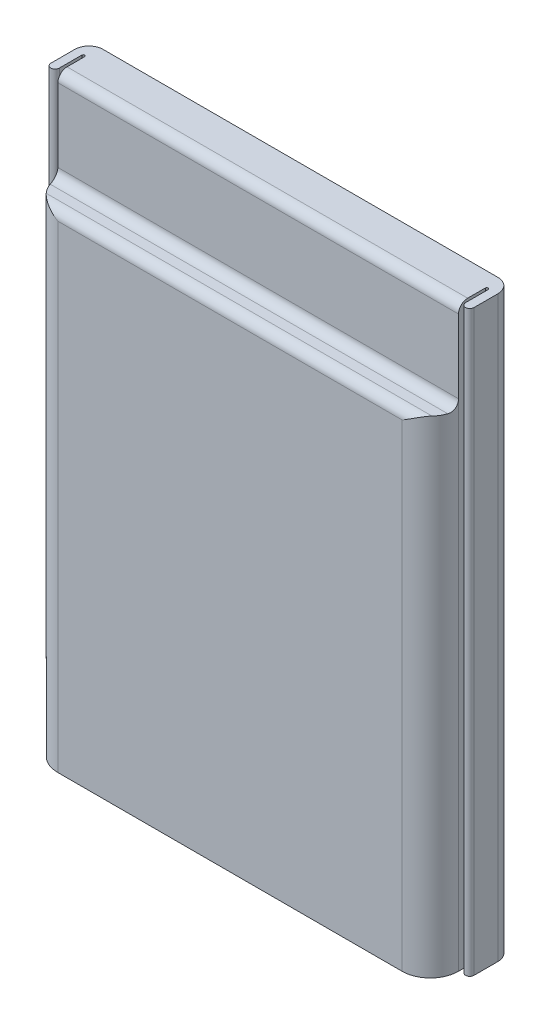
ISO-10303-21;
HEADER;
FILE_DESCRIPTION(('STEP AP214'),'2;1');
FILE_NAME('part.step','',(''),(''),'','','');
FILE_SCHEMA(('AUTOMOTIVE_DESIGN { 1 0 10303 214 1 1 1 1 }'));
ENDSEC;
DATA;
#1=APPLICATION_CONTEXT('core data for automotive mechanical design processes');
#2=APPLICATION_PROTOCOL_DEFINITION('international standard','automotive_design',2000,#1);
#3=PRODUCT_CONTEXT('',#1,'mechanical');
#4=PRODUCT('Part','Part','',(#3));
#5=PRODUCT_RELATED_PRODUCT_CATEGORY('part','',(#4));
#6=PRODUCT_DEFINITION_FORMATION('','',#4);
#7=PRODUCT_DEFINITION_CONTEXT('part definition',#1,'design');
#8=PRODUCT_DEFINITION('design','',#6,#7);
#9=PRODUCT_DEFINITION_SHAPE('','',#8);
#10=(LENGTH_UNIT() NAMED_UNIT(*) SI_UNIT(.MILLI.,.METRE.));
#11=(NAMED_UNIT(*) PLANE_ANGLE_UNIT() SI_UNIT($,.RADIAN.));
#12=(NAMED_UNIT(*) SI_UNIT($,.STERADIAN.) SOLID_ANGLE_UNIT());
#13=UNCERTAINTY_MEASURE_WITH_UNIT(LENGTH_MEASURE(1.E-05),#10,'distance_accuracy_value','');
#14=(GEOMETRIC_REPRESENTATION_CONTEXT(3) GLOBAL_UNCERTAINTY_ASSIGNED_CONTEXT((#13)) GLOBAL_UNIT_ASSIGNED_CONTEXT((#10,
#11,#12)) REPRESENTATION_CONTEXT('',''));
#15=CARTESIAN_POINT('',(0.,0.,0.));
#16=DIRECTION('',(0.,0.,1.));
#17=DIRECTION('',(1.,0.,0.));
#18=AXIS2_PLACEMENT_3D('',#15,#16,#17);
#19=CARTESIAN_POINT('',(-14.2,20.5,3.));
#20=DIRECTION('',(1.,0.,0.));
#21=DIRECTION('',(0.,0.,-1.));
#22=AXIS2_PLACEMENT_3D('',#19,#20,#21);
#23=PLANE('',#22);
#24=CARTESIAN_POINT('',(-14.2,19.85,2.35));
#25=DIRECTION('',(1.,0.,0.));
#26=DIRECTION('',(0.,0.,-1.));
#27=AXIS2_PLACEMENT_3D('',#24,#25,#26);
#28=CIRCLE('',#27,0.650000000000001);
#29=CARTESIAN_POINT('',(-14.2,20.5,2.35));
#30=VERTEX_POINT('',#29);
#31=CARTESIAN_POINT('',(-14.2,19.85,3.));
#32=VERTEX_POINT('',#31);
#33=EDGE_CURVE('E450',#30,#32,#28,.T.);
#34=ORIENTED_EDGE('',*,*,#33,.F.);
#35=DIRECTION('',(0.,0.,1.));
#36=VECTOR('',#35,1.);
#37=CARTESIAN_POINT('',(-14.2,20.5,3.));
#38=LINE('',#37,#36);
#39=CARTESIAN_POINT('',(-14.2,20.5,1.1));
#40=VERTEX_POINT('',#39);
#41=EDGE_CURVE('E266',#40,#30,#38,.T.);
#42=ORIENTED_EDGE('',*,*,#41,.F.);
#43=DIRECTION('',(0.,-1.,0.));
#44=VECTOR('',#43,1.);
#45=CARTESIAN_POINT('',(-14.2,20.5,1.1));
#46=LINE('',#45,#44);
#47=CARTESIAN_POINT('',(-14.2,-20.5,1.1));
#48=VERTEX_POINT('',#47);
#49=EDGE_CURVE('E234',#40,#48,#46,.T.);
#50=ORIENTED_EDGE('',*,*,#49,.T.);
#51=DIRECTION('',(0.,0.,1.));
#52=VECTOR('',#51,1.);
#53=CARTESIAN_POINT('',(-14.2,-20.5,3.));
#54=LINE('',#53,#52);
#55=CARTESIAN_POINT('',(-14.2,-20.5,3.));
#56=VERTEX_POINT('',#55);
#57=EDGE_CURVE('E189',#48,#56,#54,.T.);
#58=ORIENTED_EDGE('',*,*,#57,.T.);
#59=DIRECTION('',(0.,-1.,0.));
#60=VECTOR('',#59,1.);
#61=CARTESIAN_POINT('',(-14.2,20.5,3.));
#62=LINE('',#61,#60);
#63=CARTESIAN_POINT('',(-14.2,14.65,3.));
#64=VERTEX_POINT('',#63);
#65=EDGE_CURVE('E232',#64,#56,#62,.T.);
#66=ORIENTED_EDGE('',*,*,#65,.F.);
#67=DIRECTION('',(0.,-1.,0.));
#68=VECTOR('',#67,1.);
#69=CARTESIAN_POINT('',(-14.2,20.5,3.));
#70=LINE('',#69,#68);
#71=EDGE_CURVE('E433',#32,#64,#70,.T.);
#72=ORIENTED_EDGE('',*,*,#71,.F.);
#73=EDGE_LOOP('',(#34,#42,#50,#58,#66,#72));
#74=FACE_BOUND('',#73,.T.);
#75=ADVANCED_FACE('F33',(#74),#23,.F.);
#76=CARTESIAN_POINT('',(-12.2,20.5,3.));
#77=DIRECTION('',(0.,-1.,0.));
#78=DIRECTION('',(0.,0.,-1.));
#79=AXIS2_PLACEMENT_3D('',#76,#77,#78);
#80=CYLINDRICAL_SURFACE('',#79,2.);
#81=CARTESIAN_POINT('',(-14.2,14.65,3.));
#82=CARTESIAN_POINT('',(-14.1999715333076,14.6134705249712,2.99996898966149));
#83=CARTESIAN_POINT('',(-14.1999995182946,14.5769499170187,3.00307754988292));
#84=CARTESIAN_POINT('',(-14.1999580467136,14.5049609758304,3.01534640676728));
#85=CARTESIAN_POINT('',(-14.1998886483359,14.4694920271167,3.02450308771743));
#86=CARTESIAN_POINT('',(-14.1994424133602,14.4005763476328,3.04864777686902));
#87=CARTESIAN_POINT('',(-14.1990654113068,14.367130715576,3.06363892106971));
#88=CARTESIAN_POINT('',(-14.1976264276688,14.3032422256214,3.0990089930902));
#89=CARTESIAN_POINT('',(-14.1965645581985,14.2727988771835,3.11938703874022));
#90=CARTESIAN_POINT('',(-14.1933254727069,14.2159189707974,3.16482691344794));
#91=CARTESIAN_POINT('',(-14.19115317581,14.1894654021372,3.18986777807398));
#92=CARTESIAN_POINT('',(-14.185257441474,14.1411791612644,3.24390474724929));
#93=CARTESIAN_POINT('',(-14.18153437101,14.1193453976631,3.2728999149611));
#94=CARTESIAN_POINT('',(-14.172258117094,14.0812476728007,3.33333874013283));
#95=CARTESIAN_POINT('',(-14.1667389441375,14.0648908650406,3.36472917526913));
#96=CARTESIAN_POINT('',(-14.1536413514661,14.0375782654173,3.42938564281086));
#97=CARTESIAN_POINT('',(-14.1460626804103,14.0266231332334,3.46265190374891));
#98=CARTESIAN_POINT('',(-14.1309180671935,14.0122336114247,3.52177261300965));
#99=CARTESIAN_POINT('',(-14.1237967817437,14.007618429263,3.54746322722828));
#100=CARTESIAN_POINT('',(-14.1084361518207,14.0015002563595,3.59883111134542));
#101=CARTESIAN_POINT('',(-14.1001988565738,13.9999916416918,3.62450832107817));
#102=CARTESIAN_POINT('',(-14.0914280319378,14.,3.65));
#103=B_SPLINE_CURVE_WITH_KNOTS('',3,(#81,#82,#83,#84,#85,#86,#87,#88,#89,#90,#91,#92,#93,#94,
#95,#96,#97,#98,#99,#100,#101,#102),.UNSPECIFIED.,.F.,.F.,(4,2,2,2,2,2,2,2,2,2,4),(0.,
0.109443842133303,0.218822315238405,0.328259660182429,0.437679094538202,0.546617954929262,
0.655531050658533,0.762491353507339,0.86946471564608,0.950436647907691,1.03126186456902),.UNSPECIFIED.);
#104=CARTESIAN_POINT('',(-14.0914280319378,14.,3.65));
#105=VERTEX_POINT('',#104);
#106=EDGE_CURVE('E430',#64,#105,#103,.T.);
#107=ORIENTED_EDGE('',*,*,#106,.F.);
#108=ORIENTED_EDGE('',*,*,#65,.T.);
#109=CARTESIAN_POINT('',(-12.2,-20.5,3.));
#110=DIRECTION('',(0.,1.,0.));
#111=DIRECTION('',(0.,0.,1.));
#112=AXIS2_PLACEMENT_3D('',#109,#110,#111);
#113=CIRCLE('',#112,2.);
#114=CARTESIAN_POINT('',(-12.2,-20.5,5.));
#115=VERTEX_POINT('',#114);
#116=EDGE_CURVE('E192',#56,#115,#113,.T.);
#117=ORIENTED_EDGE('',*,*,#116,.T.);
#118=DIRECTION('',(0.,-1.,0.));
#119=VECTOR('',#118,1.);
#120=CARTESIAN_POINT('',(-12.2,20.5,5.));
#121=LINE('',#120,#119);
#122=CARTESIAN_POINT('',(-12.2,13.35,5.));
#123=VERTEX_POINT('',#122);
#124=EDGE_CURVE('E230',#123,#115,#121,.T.);
#125=ORIENTED_EDGE('',*,*,#124,.F.);
#126=CARTESIAN_POINT('',(-13.6756354563374,14.,4.35));
#127=CARTESIAN_POINT('',(-13.6526747888121,13.9999932469629,4.37510429602965));
#128=CARTESIAN_POINT('',(-13.629092967008,13.9985470125779,4.39958775562649));
#129=CARTESIAN_POINT('',(-13.5809067781463,13.9931451991544,4.44714747151512));
#130=CARTESIAN_POINT('',(-13.5563044500062,13.98919441785,4.47022632604328));
#131=CARTESIAN_POINT('',(-13.4816585836141,13.9742282759658,4.53680407014388));
#132=CARTESIAN_POINT('',(-13.4303126692842,13.9600840157248,4.57814755553334));
#133=CARTESIAN_POINT('',(-13.3008541290508,13.9177087843941,4.67247974823716));
#134=CARTESIAN_POINT('',(-13.2213753583094,13.8859868263596,4.72197198080512));
#135=CARTESIAN_POINT('',(-13.0589684463905,13.8141624891678,4.80851066967203));
#136=CARTESIAN_POINT('',(-12.9760211472614,13.774006663803,4.84547362186481));
#137=CARTESIAN_POINT('',(-12.7799445242252,13.6741623799292,4.91780631918262));
#138=CARTESIAN_POINT('',(-12.6660940623515,13.6124606757063,4.94841050017293));
#139=CARTESIAN_POINT('',(-12.4373647936439,13.4852882861592,4.98924690264115));
#140=CARTESIAN_POINT('',(-12.3224900789549,13.4198294206404,4.99953975746522));
#141=CARTESIAN_POINT('',(-12.2051801140564,13.3529531167111,4.99999495627204));
#142=CARTESIAN_POINT('',(-12.2025900127255,13.3514765316063,4.99999998679931));
#143=CARTESIAN_POINT('',(-12.2,13.35,5.));
#144=B_SPLINE_CURVE_WITH_KNOTS('',3,(#126,#127,#128,#129,#130,#131,#132,#133,#134,#135,#136,
#137,#138,#139,#140,#141,#142,#143),.UNSPECIFIED.,.F.,.F.,(4,2,2,2,2,2,2,2,4),(0.,
0.101961062793658,0.203727395778618,0.405233373896113,0.700228855017827,0.997153423353582,
1.39448612501562,1.79063090440368,1.79957518905046),.UNSPECIFIED.);
#145=CARTESIAN_POINT('',(-13.6756354563374,14.,4.35));
#146=VERTEX_POINT('',#145);
#147=EDGE_CURVE('E431',#146,#123,#144,.T.);
#148=ORIENTED_EDGE('',*,*,#147,.F.);
#149=CARTESIAN_POINT('',(-12.2,14.,3.));
#150=DIRECTION('',(0.,-1.,0.));
#151=DIRECTION('',(0.,0.,-1.));
#152=AXIS2_PLACEMENT_3D('',#149,#150,#151);
#153=CIRCLE('',#152,2.);
#154=EDGE_CURVE('E424',#105,#146,#153,.F.);
#155=ORIENTED_EDGE('',*,*,#154,.F.);
#156=EDGE_LOOP('',(#107,#108,#117,#125,#148,#155));
#157=FACE_BOUND('',#156,.T.);
#158=ADVANCED_FACE('F358',(#157),#80,.T.);
#159=CARTESIAN_POINT('',(12.2,20.5,3.));
#160=DIRECTION('',(0.,-1.,0.));
#161=DIRECTION('',(0.,0.,-1.));
#162=AXIS2_PLACEMENT_3D('',#159,#160,#161);
#163=CYLINDRICAL_SURFACE('',#162,2.);
#164=CARTESIAN_POINT('',(14.2,14.65,3.));
#165=CARTESIAN_POINT('',(14.1999715333076,14.6134705249712,2.99996898966149));
#166=CARTESIAN_POINT('',(14.1999995182946,14.5769499170187,3.00307754988292));
#167=CARTESIAN_POINT('',(14.1999580467136,14.5049609758304,3.01534640676728));
#168=CARTESIAN_POINT('',(14.1998886483359,14.4694920271167,3.02450308771743));
#169=CARTESIAN_POINT('',(14.1994424133602,14.4005763476328,3.04864777686902));
#170=CARTESIAN_POINT('',(14.1990654113068,14.367130715576,3.06363892106971));
#171=CARTESIAN_POINT('',(14.1976264276688,14.3032422256214,3.0990089930902));
#172=CARTESIAN_POINT('',(14.1965645581985,14.2727988771835,3.11938703874022));
#173=CARTESIAN_POINT('',(14.1933254727069,14.2159189707974,3.16482691344795));
#174=CARTESIAN_POINT('',(14.19115317581,14.1894654021372,3.18986777807399));
#175=CARTESIAN_POINT('',(14.185257441474,14.1411791612644,3.24390474724929));
#176=CARTESIAN_POINT('',(14.18153437101,14.1193453976631,3.2728999149611));
#177=CARTESIAN_POINT('',(14.172258117094,14.0812476728007,3.33333874013283));
#178=CARTESIAN_POINT('',(14.1667389441375,14.0648908650406,3.36472917526913));
#179=CARTESIAN_POINT('',(14.1536413514661,14.0375782654173,3.42938564281086));
#180=CARTESIAN_POINT('',(14.1460626804103,14.0266231332334,3.46265190374891));
#181=CARTESIAN_POINT('',(14.1309180671935,14.0122336114247,3.52177261300964));
#182=CARTESIAN_POINT('',(14.1237967817437,14.007618429263,3.54746322722828));
#183=CARTESIAN_POINT('',(14.1084361518207,14.0015002563595,3.59883111134542));
#184=CARTESIAN_POINT('',(14.1001988565738,13.9999916416918,3.62450832107817));
#185=CARTESIAN_POINT('',(14.0914280319378,14.,3.65));
#186=B_SPLINE_CURVE_WITH_KNOTS('',3,(#164,#165,#166,#167,#168,#169,#170,#171,#172,#173,#174,
#175,#176,#177,#178,#179,#180,#181,#182,#183,#184,#185),.UNSPECIFIED.,.F.,.F.,(4,2,2,2,2,2,2,2,
2,2,4),(0.,0.109443842133303,0.218822315238405,0.328259660182429,0.437679094538202,
0.546617954929263,0.655531050658534,0.76249135350734,0.86946471564608,0.950436647907691,
1.03126186456902),.UNSPECIFIED.);
#187=CARTESIAN_POINT('',(14.2,14.65,3.));
#188=VERTEX_POINT('',#187);
#189=CARTESIAN_POINT('',(14.0914280319378,14.,3.65));
#190=VERTEX_POINT('',#189);
#191=EDGE_CURVE('E337',#188,#190,#186,.T.);
#192=ORIENTED_EDGE('',*,*,#191,.T.);
#193=CARTESIAN_POINT('',(12.2,14.,3.));
#194=DIRECTION('',(0.,1.,0.));
#195=DIRECTION('',(0.,0.,1.));
#196=AXIS2_PLACEMENT_3D('',#193,#194,#195);
#197=CIRCLE('',#196,2.);
#198=CARTESIAN_POINT('',(13.6756354563374,14.,4.35));
#199=VERTEX_POINT('',#198);
#200=EDGE_CURVE('E323',#190,#199,#197,.F.);
#201=ORIENTED_EDGE('',*,*,#200,.T.);
#202=CARTESIAN_POINT('',(13.6756354563374,14.,4.35));
#203=CARTESIAN_POINT('',(13.6526747888121,13.9999932469629,4.37510429602965));
#204=CARTESIAN_POINT('',(13.629092967008,13.9985470125779,4.39958775562649));
#205=CARTESIAN_POINT('',(13.5809067781463,13.9931451991544,4.44714747151513));
#206=CARTESIAN_POINT('',(13.5563044500061,13.98919441785,4.47022632604329));
#207=CARTESIAN_POINT('',(13.4816585836141,13.9742282759658,4.53680407014389));
#208=CARTESIAN_POINT('',(13.4303126692842,13.9600840157248,4.57814755553334));
#209=CARTESIAN_POINT('',(13.3008541290508,13.9177087843941,4.67247974823716));
#210=CARTESIAN_POINT('',(13.2213753583094,13.8859868263596,4.72197198080512));
#211=CARTESIAN_POINT('',(13.0589684463905,13.8141624891678,4.80851066967203));
#212=CARTESIAN_POINT('',(12.9760211472614,13.774006663803,4.84547362186482));
#213=CARTESIAN_POINT('',(12.7799445242252,13.6741623799291,4.91780631918262));
#214=CARTESIAN_POINT('',(12.6660940623516,13.6124606757061,4.94841050017292));
#215=CARTESIAN_POINT('',(12.4373647936437,13.4852882861594,4.98924690264115));
#216=CARTESIAN_POINT('',(12.3224900789544,13.4198294206411,4.99953975746523));
#217=CARTESIAN_POINT('',(12.2051801140564,13.3529531167111,4.99999495627204));
#218=CARTESIAN_POINT('',(12.2025900127255,13.3514765316063,4.99999998679931));
#219=CARTESIAN_POINT('',(12.2,13.35,5.));
#220=B_SPLINE_CURVE_WITH_KNOTS('',3,(#202,#203,#204,#205,#206,#207,#208,#209,#210,#211,#212,
#213,#214,#215,#216,#217,#218,#219),.UNSPECIFIED.,.F.,.F.,(4,2,2,2,2,2,2,2,4),(0.,
0.101961062793669,0.203727395778643,0.405233373896116,0.700228855017819,0.997153423353591,
1.39448612501563,1.79063090440368,1.79957518905045),.UNSPECIFIED.);
#221=CARTESIAN_POINT('',(12.2,13.35,5.));
#222=VERTEX_POINT('',#221);
#223=EDGE_CURVE('E314',#199,#222,#220,.T.);
#224=ORIENTED_EDGE('',*,*,#223,.T.);
#225=DIRECTION('',(0.,-1.,0.));
#226=VECTOR('',#225,1.);
#227=CARTESIAN_POINT('',(12.2,20.5,5.));
#228=LINE('',#227,#226);
#229=CARTESIAN_POINT('',(12.2,-20.5,5.));
#230=VERTEX_POINT('',#229);
#231=EDGE_CURVE('E228',#222,#230,#228,.T.);
#232=ORIENTED_EDGE('',*,*,#231,.T.);
#233=CARTESIAN_POINT('',(12.2,-20.5,3.));
#234=DIRECTION('',(0.,1.,0.));
#235=DIRECTION('',(0.,0.,-1.));
#236=AXIS2_PLACEMENT_3D('',#233,#234,#235);
#237=CIRCLE('',#236,2.);
#238=CARTESIAN_POINT('',(14.2,-20.5,3.));
#239=VERTEX_POINT('',#238);
#240=EDGE_CURVE('E198',#230,#239,#237,.T.);
#241=ORIENTED_EDGE('',*,*,#240,.T.);
#242=DIRECTION('',(0.,-1.,0.));
#243=VECTOR('',#242,1.);
#244=CARTESIAN_POINT('',(14.2,20.5,3.));
#245=LINE('',#244,#243);
#246=EDGE_CURVE('E226',#188,#239,#245,.T.);
#247=ORIENTED_EDGE('',*,*,#246,.F.);
#248=EDGE_LOOP('',(#192,#201,#224,#232,#241,#247));
#249=FACE_BOUND('',#248,.T.);
#250=ADVANCED_FACE('F364',(#249),#163,.T.);
#251=CARTESIAN_POINT('',(14.2,20.5,1.1));
#252=DIRECTION('',(-1.,0.,0.));
#253=DIRECTION('',(0.,0.,1.));
#254=AXIS2_PLACEMENT_3D('',#251,#252,#253);
#255=PLANE('',#254);
#256=CARTESIAN_POINT('',(14.2,19.85,2.35));
#257=DIRECTION('',(-1.,0.,0.));
#258=DIRECTION('',(0.,0.,1.));
#259=AXIS2_PLACEMENT_3D('',#256,#257,#258);
#260=CIRCLE('',#259,0.650000000000001);
#261=CARTESIAN_POINT('',(14.2,20.5,2.35));
#262=VERTEX_POINT('',#261);
#263=CARTESIAN_POINT('',(14.2,19.85,3.));
#264=VERTEX_POINT('',#263);
#265=EDGE_CURVE('E48',#262,#264,#260,.F.);
#266=ORIENTED_EDGE('',*,*,#265,.T.);
#267=DIRECTION('',(0.,-1.,0.));
#268=VECTOR('',#267,1.);
#269=CARTESIAN_POINT('',(14.2,19.85,3.));
#270=LINE('',#269,#268);
#271=EDGE_CURVE('E181',#264,#188,#270,.T.);
#272=ORIENTED_EDGE('',*,*,#271,.T.);
#273=ORIENTED_EDGE('',*,*,#246,.T.);
#274=DIRECTION('',(0.,0.,-1.));
#275=VECTOR('',#274,1.);
#276=CARTESIAN_POINT('',(14.2,-20.5,1.1));
#277=LINE('',#276,#275);
#278=CARTESIAN_POINT('',(14.2,-20.5,1.1));
#279=VERTEX_POINT('',#278);
#280=EDGE_CURVE('E201',#239,#279,#277,.T.);
#281=ORIENTED_EDGE('',*,*,#280,.T.);
#282=DIRECTION('',(0.,-1.,0.));
#283=VECTOR('',#282,1.);
#284=CARTESIAN_POINT('',(14.2,20.5,1.1));
#285=LINE('',#284,#283);
#286=CARTESIAN_POINT('',(14.2,20.5,1.1));
#287=VERTEX_POINT('',#286);
#288=EDGE_CURVE('E223',#287,#279,#285,.T.);
#289=ORIENTED_EDGE('',*,*,#288,.F.);
#290=DIRECTION('',(0.,0.,-1.));
#291=VECTOR('',#290,1.);
#292=CARTESIAN_POINT('',(14.2,20.5,1.1));
#293=LINE('',#292,#291);
#294=EDGE_CURVE('E269',#262,#287,#293,.T.);
#295=ORIENTED_EDGE('',*,*,#294,.F.);
#296=EDGE_LOOP('',(#266,#272,#273,#281,#289,#295));
#297=FACE_BOUND('',#296,.T.);
#298=ADVANCED_FACE('F381',(#297),#255,.F.);
#299=CARTESIAN_POINT('',(-14.,20.5,1.));
#300=DIRECTION('',(0.,-1.,0.));
#301=DIRECTION('',(0.,0.,-1.));
#302=AXIS2_PLACEMENT_3D('',#299,#300,#301);
#303=CYLINDRICAL_SURFACE('',#302,0.999999999999999);
#304=CARTESIAN_POINT('',(-14.,-20.5,1.));
#305=DIRECTION('',(0.,1.,0.));
#306=DIRECTION('',(0.,0.,1.));
#307=AXIS2_PLACEMENT_3D('',#304,#305,#306);
#308=CIRCLE('',#307,0.999999999999999);
#309=CARTESIAN_POINT('',(-14.,-20.5,0.));
#310=VERTEX_POINT('',#309);
#311=CARTESIAN_POINT('',(-15.,-20.5,1.));
#312=VERTEX_POINT('',#311);
#313=EDGE_CURVE('E177',#310,#312,#308,.T.);
#314=ORIENTED_EDGE('',*,*,#313,.T.);
#315=DIRECTION('',(0.,-1.,0.));
#316=VECTOR('',#315,1.);
#317=CARTESIAN_POINT('',(-15.,20.5,1.));
#318=LINE('',#317,#316);
#319=CARTESIAN_POINT('',(-15.,20.5,1.));
#320=VERTEX_POINT('',#319);
#321=EDGE_CURVE('E11',#320,#312,#318,.T.);
#322=ORIENTED_EDGE('',*,*,#321,.F.);
#323=CARTESIAN_POINT('',(-14.,20.5,1.));
#324=DIRECTION('',(0.,1.,0.));
#325=DIRECTION('',(0.,0.,1.));
#326=AXIS2_PLACEMENT_3D('',#323,#324,#325);
#327=CIRCLE('',#326,0.999999999999999);
#328=CARTESIAN_POINT('',(-14.,20.5,0.));
#329=VERTEX_POINT('',#328);
#330=EDGE_CURVE('E213',#329,#320,#327,.T.);
#331=ORIENTED_EDGE('',*,*,#330,.F.);
#332=DIRECTION('',(0.,-1.,0.));
#333=VECTOR('',#332,1.);
#334=CARTESIAN_POINT('',(-14.,20.5,0.));
#335=LINE('',#334,#333);
#336=EDGE_CURVE('E173',#329,#310,#335,.T.);
#337=ORIENTED_EDGE('',*,*,#336,.T.);
#338=EDGE_LOOP('',(#314,#322,#331,#337));
#339=FACE_BOUND('',#338,.T.);
#340=ADVANCED_FACE('F35',(#339),#303,.T.);
#341=CARTESIAN_POINT('',(-15.,20.5,1.));
#342=DIRECTION('',(1.,0.,0.));
#343=DIRECTION('',(0.,0.,-1.));
#344=AXIS2_PLACEMENT_3D('',#341,#342,#343);
#345=PLANE('',#344);
#346=DIRECTION('',(0.,0.,1.));
#347=VECTOR('',#346,1.);
#348=CARTESIAN_POINT('',(-15.,-20.5,1.));
#349=LINE('',#348,#347);
#350=CARTESIAN_POINT('',(-15.,-20.5,2.7));
#351=VERTEX_POINT('',#350);
#352=EDGE_CURVE('E180',#312,#351,#349,.T.);
#353=ORIENTED_EDGE('',*,*,#352,.T.);
#354=DIRECTION('',(0.,-1.,0.));
#355=VECTOR('',#354,1.);
#356=CARTESIAN_POINT('',(-15.,20.5,2.7));
#357=LINE('',#356,#355);
#358=CARTESIAN_POINT('',(-15.,20.5,2.7));
#359=VERTEX_POINT('',#358);
#360=EDGE_CURVE('E41',#359,#351,#357,.T.);
#361=ORIENTED_EDGE('',*,*,#360,.F.);
#362=DIRECTION('',(0.,0.,1.));
#363=VECTOR('',#362,1.);
#364=CARTESIAN_POINT('',(-15.,20.5,1.));
#365=LINE('',#364,#363);
#366=EDGE_CURVE('E122',#320,#359,#365,.T.);
#367=ORIENTED_EDGE('',*,*,#366,.F.);
#368=ORIENTED_EDGE('',*,*,#321,.T.);
#369=EDGE_LOOP('',(#353,#361,#367,#368));
#370=FACE_BOUND('',#369,.T.);
#371=ADVANCED_FACE('F376',(#370),#345,.F.);
#372=CARTESIAN_POINT('',(-14.7,20.5,2.7));
#373=DIRECTION('',(0.,-1.,0.));
#374=DIRECTION('',(0.,0.,-1.));
#375=AXIS2_PLACEMENT_3D('',#372,#373,#374);
#376=CYLINDRICAL_SURFACE('',#375,0.3);
#377=CARTESIAN_POINT('',(-14.7,-20.5,2.7));
#378=DIRECTION('',(0.,1.,0.));
#379=DIRECTION('',(0.,0.,1.));
#380=AXIS2_PLACEMENT_3D('',#377,#378,#379);
#381=CIRCLE('',#380,0.3);
#382=CARTESIAN_POINT('',(-14.4,-20.5,2.7));
#383=VERTEX_POINT('',#382);
#384=EDGE_CURVE('E183',#351,#383,#381,.T.);
#385=ORIENTED_EDGE('',*,*,#384,.T.);
#386=DIRECTION('',(0.,-1.,0.));
#387=VECTOR('',#386,1.);
#388=CARTESIAN_POINT('',(-14.4,20.5,2.7));
#389=LINE('',#388,#387);
#390=CARTESIAN_POINT('',(-14.4,20.5,2.7));
#391=VERTEX_POINT('',#390);
#392=EDGE_CURVE('E240',#391,#383,#389,.T.);
#393=ORIENTED_EDGE('',*,*,#392,.F.);
#394=CARTESIAN_POINT('',(-14.7,20.5,2.7));
#395=DIRECTION('',(0.,1.,0.));
#396=DIRECTION('',(0.,0.,1.));
#397=AXIS2_PLACEMENT_3D('',#394,#395,#396);
#398=CIRCLE('',#397,0.3);
#399=EDGE_CURVE('E248',#359,#391,#398,.T.);
#400=ORIENTED_EDGE('',*,*,#399,.F.);
#401=ORIENTED_EDGE('',*,*,#360,.T.);
#402=EDGE_LOOP('',(#385,#393,#400,#401));
#403=FACE_BOUND('',#402,.T.);
#404=ADVANCED_FACE('F246',(#403),#376,.T.);
#405=CARTESIAN_POINT('',(-14.4,20.5,2.7));
#406=DIRECTION('',(-1.,0.,0.));
#407=DIRECTION('',(0.,0.,1.));
#408=AXIS2_PLACEMENT_3D('',#405,#406,#407);
#409=PLANE('',#408);
#410=DIRECTION('',(0.,0.,-1.));
#411=VECTOR('',#410,1.);
#412=CARTESIAN_POINT('',(-14.4,-20.5,2.7));
#413=LINE('',#412,#411);
#414=CARTESIAN_POINT('',(-14.4,-20.5,1.1));
#415=VERTEX_POINT('',#414);
#416=EDGE_CURVE('E185',#383,#415,#413,.T.);
#417=ORIENTED_EDGE('',*,*,#416,.T.);
#418=DIRECTION('',(0.,-1.,0.));
#419=VECTOR('',#418,1.);
#420=CARTESIAN_POINT('',(-14.4,20.5,1.1));
#421=LINE('',#420,#419);
#422=CARTESIAN_POINT('',(-14.4,20.5,1.1));
#423=VERTEX_POINT('',#422);
#424=EDGE_CURVE('E237',#423,#415,#421,.T.);
#425=ORIENTED_EDGE('',*,*,#424,.F.);
#426=DIRECTION('',(0.,0.,-1.));
#427=VECTOR('',#426,1.);
#428=CARTESIAN_POINT('',(-14.4,20.5,2.7));
#429=LINE('',#428,#427);
#430=EDGE_CURVE('E267',#391,#423,#429,.T.);
#431=ORIENTED_EDGE('',*,*,#430,.F.);
#432=ORIENTED_EDGE('',*,*,#392,.T.);
#433=EDGE_LOOP('',(#417,#425,#431,#432));
#434=FACE_BOUND('',#433,.T.);
#435=ADVANCED_FACE('F257',(#434),#409,.F.);
#436=CARTESIAN_POINT('',(-14.3,20.5,1.1));
#437=DIRECTION('',(0.,-1.,0.));
#438=DIRECTION('',(0.,0.,-1.));
#439=AXIS2_PLACEMENT_3D('',#436,#437,#438);
#440=CYLINDRICAL_SURFACE('',#439,0.0999999999999994);
#441=CARTESIAN_POINT('',(-14.3,-20.5,1.1));
#442=DIRECTION('',(0.,-1.,0.));
#443=DIRECTION('',(0.,0.,1.));
#444=AXIS2_PLACEMENT_3D('',#441,#442,#443);
#445=CIRCLE('',#444,0.0999999999999994);
#446=EDGE_CURVE('E187',#415,#48,#445,.T.);
#447=ORIENTED_EDGE('',*,*,#446,.T.);
#448=ORIENTED_EDGE('',*,*,#49,.F.);
#449=CARTESIAN_POINT('',(-14.3,20.5,1.1));
#450=DIRECTION('',(0.,-1.,0.));
#451=DIRECTION('',(0.,0.,1.));
#452=AXIS2_PLACEMENT_3D('',#449,#450,#451);
#453=CIRCLE('',#452,0.0999999999999994);
#454=EDGE_CURVE('E263',#423,#40,#453,.T.);
#455=ORIENTED_EDGE('',*,*,#454,.F.);
#456=ORIENTED_EDGE('',*,*,#424,.T.);
#457=EDGE_LOOP('',(#447,#448,#455,#456));
#458=FACE_BOUND('',#457,.T.);
#459=ADVANCED_FACE('F261',(#458),#440,.F.);
#460=CARTESIAN_POINT('',(-12.2,20.5,5.));
#461=DIRECTION('',(0.,0.,-1.));
#462=DIRECTION('',(-1.,0.,0.));
#463=AXIS2_PLACEMENT_3D('',#460,#461,#462);
#464=PLANE('',#463);
#465=ORIENTED_EDGE('',*,*,#231,.F.);
#466=DIRECTION('',(-1.,0.,0.));
#467=VECTOR('',#466,1.);
#468=CARTESIAN_POINT('',(15.001,13.35,5.));
#469=LINE('',#468,#467);
#470=EDGE_CURVE('E299',#222,#123,#469,.T.);
#471=ORIENTED_EDGE('',*,*,#470,.T.);
#472=ORIENTED_EDGE('',*,*,#124,.T.);
#473=DIRECTION('',(1.,0.,0.));
#474=VECTOR('',#473,1.);
#475=CARTESIAN_POINT('',(-12.2,-20.5,5.));
#476=LINE('',#475,#474);
#477=EDGE_CURVE('E195',#115,#230,#476,.T.);
#478=ORIENTED_EDGE('',*,*,#477,.T.);
#479=EDGE_LOOP('',(#465,#471,#472,#478));
#480=FACE_BOUND('',#479,.T.);
#481=ADVANCED_FACE('F372',(#480),#464,.F.);
#482=CARTESIAN_POINT('',(14.3,20.5,1.1));
#483=DIRECTION('',(0.,-1.,0.));
#484=DIRECTION('',(0.,0.,-1.));
#485=AXIS2_PLACEMENT_3D('',#482,#483,#484);
#486=CYLINDRICAL_SURFACE('',#485,0.0999999999999977);
#487=CARTESIAN_POINT('',(14.3,-20.5,1.1));
#488=DIRECTION('',(0.,-1.,0.));
#489=DIRECTION('',(0.,0.,-1.));
#490=AXIS2_PLACEMENT_3D('',#487,#488,#489);
#491=CIRCLE('',#490,0.0999999999999977);
#492=CARTESIAN_POINT('',(14.4,-20.5,1.1));
#493=VERTEX_POINT('',#492);
#494=EDGE_CURVE('E203',#279,#493,#491,.T.);
#495=ORIENTED_EDGE('',*,*,#494,.T.);
#496=DIRECTION('',(0.,-1.,0.));
#497=VECTOR('',#496,1.);
#498=CARTESIAN_POINT('',(14.4,20.5,1.1));
#499=LINE('',#498,#497);
#500=CARTESIAN_POINT('',(14.4,20.5,1.1));
#501=VERTEX_POINT('',#500);
#502=EDGE_CURVE('E220',#501,#493,#499,.T.);
#503=ORIENTED_EDGE('',*,*,#502,.F.);
#504=CARTESIAN_POINT('',(14.3,20.5,1.1));
#505=DIRECTION('',(0.,-1.,0.));
#506=DIRECTION('',(0.,0.,-1.));
#507=AXIS2_PLACEMENT_3D('',#504,#505,#506);
#508=CIRCLE('',#507,0.0999999999999977);
#509=EDGE_CURVE('E275',#287,#501,#508,.T.);
#510=ORIENTED_EDGE('',*,*,#509,.F.);
#511=ORIENTED_EDGE('',*,*,#288,.T.);
#512=EDGE_LOOP('',(#495,#503,#510,#511));
#513=FACE_BOUND('',#512,.T.);
#514=ADVANCED_FACE('F393',(#513),#486,.F.);
#515=CARTESIAN_POINT('',(14.4,20.5,2.70000000000001));
#516=DIRECTION('',(1.,0.,0.));
#517=DIRECTION('',(0.,0.,-1.));
#518=AXIS2_PLACEMENT_3D('',#515,#516,#517);
#519=PLANE('',#518);
#520=DIRECTION('',(0.,0.,1.));
#521=VECTOR('',#520,1.);
#522=CARTESIAN_POINT('',(14.4,-20.5,2.70000000000001));
#523=LINE('',#522,#521);
#524=CARTESIAN_POINT('',(14.4,-20.5,2.70000000000001));
#525=VERTEX_POINT('',#524);
#526=EDGE_CURVE('E205',#493,#525,#523,.T.);
#527=ORIENTED_EDGE('',*,*,#526,.T.);
#528=DIRECTION('',(0.,-1.,0.));
#529=VECTOR('',#528,1.);
#530=CARTESIAN_POINT('',(14.4,20.5,2.70000000000001));
#531=LINE('',#530,#529);
#532=CARTESIAN_POINT('',(14.4,20.5,2.70000000000001));
#533=VERTEX_POINT('',#532);
#534=EDGE_CURVE('E217',#533,#525,#531,.T.);
#535=ORIENTED_EDGE('',*,*,#534,.F.);
#536=DIRECTION('',(0.,0.,1.));
#537=VECTOR('',#536,1.);
#538=CARTESIAN_POINT('',(14.4,20.5,2.70000000000001));
#539=LINE('',#538,#537);
#540=EDGE_CURVE('E277',#501,#533,#539,.T.);
#541=ORIENTED_EDGE('',*,*,#540,.F.);
#542=ORIENTED_EDGE('',*,*,#502,.T.);
#543=EDGE_LOOP('',(#527,#535,#541,#542));
#544=FACE_BOUND('',#543,.T.);
#545=ADVANCED_FACE('F283',(#544),#519,.F.);
#546=CARTESIAN_POINT('',(14.7,20.5,2.70000000000001));
#547=DIRECTION('',(0.,-1.,0.));
#548=DIRECTION('',(0.,0.,-1.));
#549=AXIS2_PLACEMENT_3D('',#546,#547,#548);
#550=CYLINDRICAL_SURFACE('',#549,0.300000000000002);
#551=CARTESIAN_POINT('',(14.7,-20.5,2.70000000000001));
#552=DIRECTION('',(0.,1.,0.));
#553=DIRECTION('',(0.,0.,-1.));
#554=AXIS2_PLACEMENT_3D('',#551,#552,#553);
#555=CIRCLE('',#554,0.300000000000002);
#556=CARTESIAN_POINT('',(15.,-20.5,2.70000000000001));
#557=VERTEX_POINT('',#556);
#558=EDGE_CURVE('E207',#525,#557,#555,.T.);
#559=ORIENTED_EDGE('',*,*,#558,.T.);
#560=DIRECTION('',(0.,-1.,0.));
#561=VECTOR('',#560,1.);
#562=CARTESIAN_POINT('',(15.,20.5,2.70000000000001));
#563=LINE('',#562,#561);
#564=CARTESIAN_POINT('',(15.,20.5,2.70000000000001));
#565=VERTEX_POINT('',#564);
#566=EDGE_CURVE('E168',#565,#557,#563,.T.);
#567=ORIENTED_EDGE('',*,*,#566,.F.);
#568=CARTESIAN_POINT('',(14.7,20.5,2.70000000000001));
#569=DIRECTION('',(0.,1.,0.));
#570=DIRECTION('',(0.,0.,-1.));
#571=AXIS2_PLACEMENT_3D('',#568,#569,#570);
#572=CIRCLE('',#571,0.300000000000002);
#573=EDGE_CURVE('E156',#533,#565,#572,.T.);
#574=ORIENTED_EDGE('',*,*,#573,.F.);
#575=ORIENTED_EDGE('',*,*,#534,.T.);
#576=EDGE_LOOP('',(#559,#567,#574,#575));
#577=FACE_BOUND('',#576,.T.);
#578=ADVANCED_FACE('F287',(#577),#550,.T.);
#579=CARTESIAN_POINT('',(15.,20.5,1.));
#580=DIRECTION('',(-1.,0.,0.));
#581=DIRECTION('',(0.,0.,1.));
#582=AXIS2_PLACEMENT_3D('',#579,#580,#581);
#583=PLANE('',#582);
#584=DIRECTION('',(0.,0.,-1.));
#585=VECTOR('',#584,1.);
#586=CARTESIAN_POINT('',(15.,-20.5,1.));
#587=LINE('',#586,#585);
#588=CARTESIAN_POINT('',(15.,-20.5,1.));
#589=VERTEX_POINT('',#588);
#590=EDGE_CURVE('E165',#557,#589,#587,.T.);
#591=ORIENTED_EDGE('',*,*,#590,.T.);
#592=DIRECTION('',(0.,-1.,0.));
#593=VECTOR('',#592,1.);
#594=CARTESIAN_POINT('',(15.,20.5,1.));
#595=LINE('',#594,#593);
#596=CARTESIAN_POINT('',(15.,20.5,1.));
#597=VERTEX_POINT('',#596);
#598=EDGE_CURVE('E162',#597,#589,#595,.T.);
#599=ORIENTED_EDGE('',*,*,#598,.F.);
#600=DIRECTION('',(0.,0.,-1.));
#601=VECTOR('',#600,1.);
#602=CARTESIAN_POINT('',(15.,20.5,1.));
#603=LINE('',#602,#601);
#604=EDGE_CURVE('E149',#565,#597,#603,.T.);
#605=ORIENTED_EDGE('',*,*,#604,.F.);
#606=ORIENTED_EDGE('',*,*,#566,.T.);
#607=EDGE_LOOP('',(#591,#599,#605,#606));
#608=FACE_BOUND('',#607,.T.);
#609=ADVANCED_FACE('F163',(#608),#583,.F.);
#610=CARTESIAN_POINT('',(14.,20.5,1.));
#611=DIRECTION('',(0.,-1.,0.));
#612=DIRECTION('',(0.,0.,-1.));
#613=AXIS2_PLACEMENT_3D('',#610,#611,#612);
#614=CYLINDRICAL_SURFACE('',#613,1.);
#615=CARTESIAN_POINT('',(14.,-20.5,1.));
#616=DIRECTION('',(0.,1.,0.));
#617=DIRECTION('',(0.,0.,-1.));
#618=AXIS2_PLACEMENT_3D('',#615,#616,#617);
#619=CIRCLE('',#618,1.);
#620=CARTESIAN_POINT('',(14.,-20.5,0.));
#621=VERTEX_POINT('',#620);
#622=EDGE_CURVE('E210',#589,#621,#619,.T.);
#623=ORIENTED_EDGE('',*,*,#622,.T.);
#624=DIRECTION('',(0.,-1.,0.));
#625=VECTOR('',#624,1.);
#626=CARTESIAN_POINT('',(14.,20.5,0.));
#627=LINE('',#626,#625);
#628=CARTESIAN_POINT('',(14.,20.5,0.));
#629=VERTEX_POINT('',#628);
#630=EDGE_CURVE('E169',#629,#621,#627,.T.);
#631=ORIENTED_EDGE('',*,*,#630,.F.);
#632=CARTESIAN_POINT('',(14.,20.5,1.));
#633=DIRECTION('',(0.,1.,0.));
#634=DIRECTION('',(0.,0.,-1.));
#635=AXIS2_PLACEMENT_3D('',#632,#633,#634);
#636=CIRCLE('',#635,1.);
#637=EDGE_CURVE('E153',#597,#629,#636,.T.);
#638=ORIENTED_EDGE('',*,*,#637,.F.);
#639=ORIENTED_EDGE('',*,*,#598,.T.);
#640=EDGE_LOOP('',(#623,#631,#638,#639));
#641=FACE_BOUND('',#640,.T.);
#642=ADVANCED_FACE('F171',(#641),#614,.T.);
#643=CARTESIAN_POINT('',(-14.,20.5,0.));
#644=DIRECTION('',(0.,0.,1.));
#645=DIRECTION('',(1.,0.,0.));
#646=AXIS2_PLACEMENT_3D('',#643,#644,#645);
#647=PLANE('',#646);
#648=DIRECTION('',(-1.,0.,0.));
#649=VECTOR('',#648,1.);
#650=CARTESIAN_POINT('',(-14.,-20.5,0.));
#651=LINE('',#650,#649);
#652=EDGE_CURVE('E114',#621,#310,#651,.T.);
#653=ORIENTED_EDGE('',*,*,#652,.T.);
#654=ORIENTED_EDGE('',*,*,#336,.F.);
#655=DIRECTION('',(-1.,0.,0.));
#656=VECTOR('',#655,1.);
#657=CARTESIAN_POINT('',(-14.,20.5,0.));
#658=LINE('',#657,#656);
#659=EDGE_CURVE('E57',#629,#329,#658,.T.);
#660=ORIENTED_EDGE('',*,*,#659,.F.);
#661=ORIENTED_EDGE('',*,*,#630,.T.);
#662=EDGE_LOOP('',(#653,#654,#660,#661));
#663=FACE_BOUND('',#662,.T.);
#664=ADVANCED_FACE('F288',(#663),#647,.F.);
#665=CARTESIAN_POINT('',(-14.,20.5,1.));
#666=DIRECTION('',(0.,1.,0.));
#667=DIRECTION('',(0.,0.,1.));
#668=AXIS2_PLACEMENT_3D('',#665,#666,#667);
#669=PLANE('',#668);
#670=DIRECTION('',(-1.,0.,0.));
#671=VECTOR('',#670,1.);
#672=CARTESIAN_POINT('',(15.001,20.5,2.35));
#673=LINE('',#672,#671);
#674=EDGE_CURVE('E297',#262,#30,#673,.T.);
#675=ORIENTED_EDGE('',*,*,#674,.F.);
#676=ORIENTED_EDGE('',*,*,#294,.T.);
#677=ORIENTED_EDGE('',*,*,#509,.T.);
#678=ORIENTED_EDGE('',*,*,#540,.T.);
#679=ORIENTED_EDGE('',*,*,#573,.T.);
#680=ORIENTED_EDGE('',*,*,#604,.T.);
#681=ORIENTED_EDGE('',*,*,#637,.T.);
#682=ORIENTED_EDGE('',*,*,#659,.T.);
#683=ORIENTED_EDGE('',*,*,#330,.T.);
#684=ORIENTED_EDGE('',*,*,#366,.T.);
#685=ORIENTED_EDGE('',*,*,#399,.T.);
#686=ORIENTED_EDGE('',*,*,#430,.T.);
#687=ORIENTED_EDGE('',*,*,#454,.T.);
#688=ORIENTED_EDGE('',*,*,#41,.T.);
#689=EDGE_LOOP('',(#675,#676,#677,#678,#679,#680,#681,#682,#683,#684,#685,#686,#687,#688));
#690=FACE_BOUND('',#689,.T.);
#691=ADVANCED_FACE('F151',(#690),#669,.T.);
#692=CARTESIAN_POINT('',(-14.,-20.5,1.));
#693=DIRECTION('',(0.,1.,0.));
#694=DIRECTION('',(0.,0.,1.));
#695=AXIS2_PLACEMENT_3D('',#692,#693,#694);
#696=PLANE('',#695);
#697=ORIENTED_EDGE('',*,*,#313,.F.);
#698=ORIENTED_EDGE('',*,*,#652,.F.);
#699=ORIENTED_EDGE('',*,*,#622,.F.);
#700=ORIENTED_EDGE('',*,*,#590,.F.);
#701=ORIENTED_EDGE('',*,*,#558,.F.);
#702=ORIENTED_EDGE('',*,*,#526,.F.);
#703=ORIENTED_EDGE('',*,*,#494,.F.);
#704=ORIENTED_EDGE('',*,*,#280,.F.);
#705=ORIENTED_EDGE('',*,*,#240,.F.);
#706=ORIENTED_EDGE('',*,*,#477,.F.);
#707=ORIENTED_EDGE('',*,*,#116,.F.);
#708=ORIENTED_EDGE('',*,*,#57,.F.);
#709=ORIENTED_EDGE('',*,*,#446,.F.);
#710=ORIENTED_EDGE('',*,*,#416,.F.);
#711=ORIENTED_EDGE('',*,*,#384,.F.);
#712=ORIENTED_EDGE('',*,*,#352,.F.);
#713=EDGE_LOOP('',(#697,#698,#699,#700,#701,#702,#703,#704,#705,#706,#707,#708,#709,#710,#711,#712));
#714=FACE_BOUND('',#713,.T.);
#715=ADVANCED_FACE('F252',(#714),#696,.F.);
#716=CARTESIAN_POINT('',(15.001,19.85,3.));
#717=DIRECTION('',(0.,0.,1.));
#718=DIRECTION('',(0.,-1.,0.));
#719=AXIS2_PLACEMENT_3D('',#716,#717,#718);
#720=PLANE('',#719);
#721=DIRECTION('',(-1.,0.,0.));
#722=VECTOR('',#721,1.);
#723=CARTESIAN_POINT('',(15.001,19.85,3.));
#724=LINE('',#723,#722);
#725=EDGE_CURVE('E311',#264,#32,#724,.T.);
#726=ORIENTED_EDGE('',*,*,#725,.T.);
#727=ORIENTED_EDGE('',*,*,#71,.T.);
#728=DIRECTION('',(-1.,0.,0.));
#729=VECTOR('',#728,1.);
#730=CARTESIAN_POINT('',(15.001,14.65,3.));
#731=LINE('',#730,#729);
#732=EDGE_CURVE('E308',#188,#64,#731,.T.);
#733=ORIENTED_EDGE('',*,*,#732,.F.);
#734=ORIENTED_EDGE('',*,*,#271,.F.);
#735=EDGE_LOOP('',(#726,#727,#733,#734));
#736=FACE_BOUND('',#735,.T.);
#737=ADVANCED_FACE('F334',(#736),#720,.T.);
#738=CARTESIAN_POINT('',(15.001,14.65,3.65));
#739=DIRECTION('',(-1.,0.,0.));
#740=DIRECTION('',(0.,0.,1.));
#741=AXIS2_PLACEMENT_3D('',#738,#739,#740);
#742=CYLINDRICAL_SURFACE('',#741,0.650000000000001);
#743=ORIENTED_EDGE('',*,*,#732,.T.);
#744=ORIENTED_EDGE('',*,*,#106,.T.);
#745=DIRECTION('',(-1.,0.,0.));
#746=VECTOR('',#745,1.);
#747=CARTESIAN_POINT('',(15.001,14.,3.65));
#748=LINE('',#747,#746);
#749=EDGE_CURVE('E305',#190,#105,#748,.T.);
#750=ORIENTED_EDGE('',*,*,#749,.F.);
#751=ORIENTED_EDGE('',*,*,#191,.F.);
#752=EDGE_LOOP('',(#743,#744,#750,#751));
#753=FACE_BOUND('',#752,.T.);
#754=ADVANCED_FACE('F345',(#753),#742,.F.);
#755=CARTESIAN_POINT('',(15.001,14.,3.65));
#756=DIRECTION('',(0.,1.,0.));
#757=DIRECTION('',(0.,0.,1.));
#758=AXIS2_PLACEMENT_3D('',#755,#756,#757);
#759=PLANE('',#758);
#760=ORIENTED_EDGE('',*,*,#749,.T.);
#761=ORIENTED_EDGE('',*,*,#154,.T.);
#762=DIRECTION('',(-1.,0.,0.));
#763=VECTOR('',#762,1.);
#764=CARTESIAN_POINT('',(15.001,14.,4.35));
#765=LINE('',#764,#763);
#766=EDGE_CURVE('E302',#199,#146,#765,.T.);
#767=ORIENTED_EDGE('',*,*,#766,.F.);
#768=ORIENTED_EDGE('',*,*,#200,.F.);
#769=EDGE_LOOP('',(#760,#761,#767,#768));
#770=FACE_BOUND('',#769,.T.);
#771=ADVANCED_FACE('F348',(#770),#759,.T.);
#772=CARTESIAN_POINT('',(15.001,13.35,4.35));
#773=DIRECTION('',(-1.,0.,0.));
#774=DIRECTION('',(0.,0.,1.));
#775=AXIS2_PLACEMENT_3D('',#772,#773,#774);
#776=CYLINDRICAL_SURFACE('',#775,0.649999999999999);
#777=ORIENTED_EDGE('',*,*,#766,.T.);
#778=ORIENTED_EDGE('',*,*,#147,.T.);
#779=ORIENTED_EDGE('',*,*,#470,.F.);
#780=ORIENTED_EDGE('',*,*,#223,.F.);
#781=EDGE_LOOP('',(#777,#778,#779,#780));
#782=FACE_BOUND('',#781,.T.);
#783=ADVANCED_FACE('F325',(#782),#776,.T.);
#784=CARTESIAN_POINT('',(15.001,19.85,2.35));
#785=DIRECTION('',(-1.,0.,0.));
#786=DIRECTION('',(0.,0.,1.));
#787=AXIS2_PLACEMENT_3D('',#784,#785,#786);
#788=CYLINDRICAL_SURFACE('',#787,0.650000000000001);
#789=ORIENTED_EDGE('',*,*,#674,.T.);
#790=ORIENTED_EDGE('',*,*,#33,.T.);
#791=ORIENTED_EDGE('',*,*,#725,.F.);
#792=ORIENTED_EDGE('',*,*,#265,.F.);
#793=EDGE_LOOP('',(#789,#790,#791,#792));
#794=FACE_BOUND('',#793,.T.);
#795=ADVANCED_FACE('F355',(#794),#788,.T.);
#796=CLOSED_SHELL('',(#75,#158,#250,#298,#340,#371,#404,#435,#459,#481,#514,#545,#578,#609,#642,
#664,#691,#715,#737,#754,#771,#783,#795));
#797=MANIFOLD_SOLID_BREP('B2',#796);
#798=ADVANCED_BREP_SHAPE_REPRESENTATION('',(#18,#797),#14);
#799=SHAPE_DEFINITION_REPRESENTATION(#9,#798);
ENDSEC;
END-ISO-10303-21;
